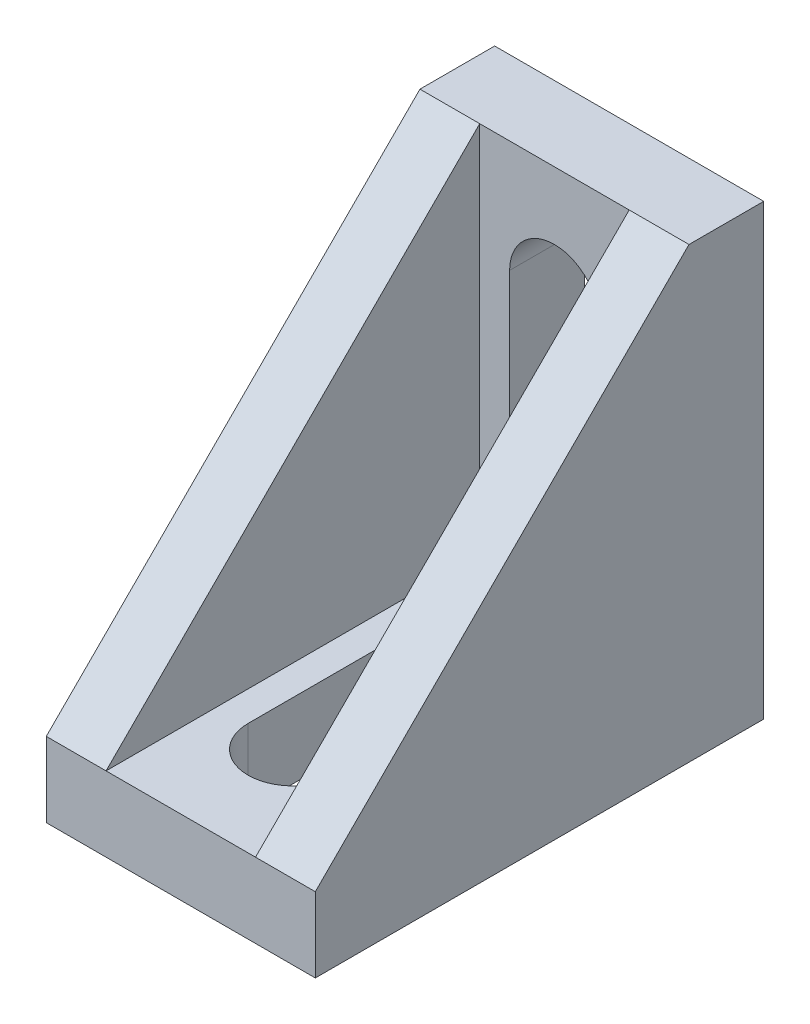
ISO-10303-21;
HEADER;
FILE_DESCRIPTION(('STEP AP214'),'2;1');
FILE_NAME('part.step','',(''),(''),'','','');
FILE_SCHEMA(('AUTOMOTIVE_DESIGN { 1 0 10303 214 1 1 1 1 }'));
ENDSEC;
DATA;
#1=APPLICATION_CONTEXT('core data for automotive mechanical design processes');
#2=APPLICATION_PROTOCOL_DEFINITION('international standard','automotive_design',2000,#1);
#3=PRODUCT_CONTEXT('',#1,'mechanical');
#4=PRODUCT('Part','Part','',(#3));
#5=PRODUCT_RELATED_PRODUCT_CATEGORY('part','',(#4));
#6=PRODUCT_DEFINITION_FORMATION('','',#4);
#7=PRODUCT_DEFINITION_CONTEXT('part definition',#1,'design');
#8=PRODUCT_DEFINITION('design','',#6,#7);
#9=PRODUCT_DEFINITION_SHAPE('','',#8);
#10=(LENGTH_UNIT() NAMED_UNIT(*) SI_UNIT(.MILLI.,.METRE.));
#11=(NAMED_UNIT(*) PLANE_ANGLE_UNIT() SI_UNIT($,.RADIAN.));
#12=(NAMED_UNIT(*) SI_UNIT($,.STERADIAN.) SOLID_ANGLE_UNIT());
#13=UNCERTAINTY_MEASURE_WITH_UNIT(LENGTH_MEASURE(1.E-05),#10,'distance_accuracy_value','');
#14=(GEOMETRIC_REPRESENTATION_CONTEXT(3) GLOBAL_UNCERTAINTY_ASSIGNED_CONTEXT((#13)) GLOBAL_UNIT_ASSIGNED_CONTEXT((#10,
#11,#12)) REPRESENTATION_CONTEXT('',''));
#15=CARTESIAN_POINT('',(0.,0.,0.));
#16=DIRECTION('',(0.,0.,1.));
#17=DIRECTION('',(1.,0.,0.));
#18=AXIS2_PLACEMENT_3D('',#15,#16,#17);
#19=CARTESIAN_POINT('',(0.,0.,5.));
#20=DIRECTION('',(0.,0.,1.));
#21=DIRECTION('',(1.,0.,0.));
#22=AXIS2_PLACEMENT_3D('',#19,#20,#21);
#23=PLANE('',#22);
#24=CARTESIAN_POINT('',(9.,12.5,5.));
#25=DIRECTION('',(0.,0.,1.));
#26=DIRECTION('',(1.,0.,0.));
#27=AXIS2_PLACEMENT_3D('',#24,#25,#26);
#28=CIRCLE('',#27,3.);
#29=CARTESIAN_POINT('',(6.,12.5,5.));
#30=VERTEX_POINT('',#29);
#31=CARTESIAN_POINT('',(12.,12.5,5.));
#32=VERTEX_POINT('',#31);
#33=EDGE_CURVE('E217',#30,#32,#28,.T.);
#34=ORIENTED_EDGE('',*,*,#33,.F.);
#35=DIRECTION('',(0.,-1.,0.));
#36=VECTOR('',#35,1.);
#37=CARTESIAN_POINT('',(6.,0.,5.));
#38=LINE('',#37,#36);
#39=CARTESIAN_POINT('',(5.99999999999999,22.5,5.));
#40=VERTEX_POINT('',#39);
#41=EDGE_CURVE('E220',#40,#30,#38,.T.);
#42=ORIENTED_EDGE('',*,*,#41,.F.);
#43=CARTESIAN_POINT('',(8.99999999999999,22.5,5.));
#44=DIRECTION('',(0.,0.,1.));
#45=DIRECTION('',(1.,0.,0.));
#46=AXIS2_PLACEMENT_3D('',#43,#44,#45);
#47=CIRCLE('',#46,3.);
#48=CARTESIAN_POINT('',(12.,22.5,5.));
#49=VERTEX_POINT('',#48);
#50=EDGE_CURVE('E224',#49,#40,#47,.T.);
#51=ORIENTED_EDGE('',*,*,#50,.F.);
#52=DIRECTION('',(0.,-1.,0.));
#53=VECTOR('',#52,1.);
#54=CARTESIAN_POINT('',(12.,0.,5.));
#55=LINE('',#54,#53);
#56=EDGE_CURVE('E227',#49,#32,#55,.T.);
#57=ORIENTED_EDGE('',*,*,#56,.T.);
#58=EDGE_LOOP('',(#34,#42,#51,#57));
#59=FACE_BOUND('',#58,.T.);
#60=DIRECTION('',(0.,-1.,0.));
#61=VECTOR('',#60,1.);
#62=CARTESIAN_POINT('',(4.,0.,5.));
#63=LINE('',#62,#61);
#64=CARTESIAN_POINT('',(4.,30.,5.));
#65=VERTEX_POINT('',#64);
#66=CARTESIAN_POINT('',(4.,8.,5.));
#67=VERTEX_POINT('',#66);
#68=EDGE_CURVE('E177',#65,#67,#63,.T.);
#69=ORIENTED_EDGE('',*,*,#68,.T.);
#70=DIRECTION('',(-1.,0.,0.));
#71=VECTOR('',#70,1.);
#72=CARTESIAN_POINT('',(0.,8.,5.));
#73=LINE('',#72,#71);
#74=CARTESIAN_POINT('',(14.,8.,5.));
#75=VERTEX_POINT('',#74);
#76=EDGE_CURVE('E42',#67,#75,#73,.F.);
#77=ORIENTED_EDGE('',*,*,#76,.T.);
#78=DIRECTION('',(0.,1.,0.));
#79=VECTOR('',#78,1.);
#80=CARTESIAN_POINT('',(14.,0.,5.));
#81=LINE('',#80,#79);
#82=CARTESIAN_POINT('',(14.,30.,5.));
#83=VERTEX_POINT('',#82);
#84=EDGE_CURVE('E358',#75,#83,#81,.T.);
#85=ORIENTED_EDGE('',*,*,#84,.T.);
#86=DIRECTION('',(1.,0.,0.));
#87=VECTOR('',#86,1.);
#88=CARTESIAN_POINT('',(0.,30.,5.));
#89=LINE('',#88,#87);
#90=EDGE_CURVE('E229',#65,#83,#89,.T.);
#91=ORIENTED_EDGE('',*,*,#90,.F.);
#92=EDGE_LOOP('',(#69,#77,#85,#91));
#93=FACE_BOUND('',#92,.T.);
#94=ADVANCED_FACE('F34',(#59,#93),#23,.T.);
#95=CARTESIAN_POINT('',(0.,5.,0.));
#96=DIRECTION('',(0.,-1.,0.));
#97=DIRECTION('',(0.,0.,-1.));
#98=AXIS2_PLACEMENT_3D('',#95,#96,#97);
#99=PLANE('',#98);
#100=CARTESIAN_POINT('',(9.,5.,22.5));
#101=DIRECTION('',(0.,-1.,0.));
#102=DIRECTION('',(0.,0.,-1.));
#103=AXIS2_PLACEMENT_3D('',#100,#101,#102);
#104=CIRCLE('',#103,3.);
#105=CARTESIAN_POINT('',(12.,5.,22.5));
#106=VERTEX_POINT('',#105);
#107=CARTESIAN_POINT('',(5.99999999999999,5.,22.5));
#108=VERTEX_POINT('',#107);
#109=EDGE_CURVE('E204',#106,#108,#104,.T.);
#110=ORIENTED_EDGE('',*,*,#109,.T.);
#111=DIRECTION('',(0.,0.,1.));
#112=VECTOR('',#111,1.);
#113=CARTESIAN_POINT('',(6.,5.,0.));
#114=LINE('',#113,#112);
#115=CARTESIAN_POINT('',(6.,5.,12.5));
#116=VERTEX_POINT('',#115);
#117=EDGE_CURVE('E165',#116,#108,#114,.T.);
#118=ORIENTED_EDGE('',*,*,#117,.F.);
#119=CARTESIAN_POINT('',(9.,5.,12.5));
#120=DIRECTION('',(0.,-1.,0.));
#121=DIRECTION('',(0.,0.,-1.));
#122=AXIS2_PLACEMENT_3D('',#119,#120,#121);
#123=CIRCLE('',#122,3.);
#124=CARTESIAN_POINT('',(12.,5.,12.5));
#125=VERTEX_POINT('',#124);
#126=EDGE_CURVE('E349',#116,#125,#123,.T.);
#127=ORIENTED_EDGE('',*,*,#126,.T.);
#128=DIRECTION('',(0.,0.,1.));
#129=VECTOR('',#128,1.);
#130=CARTESIAN_POINT('',(12.,5.,0.));
#131=LINE('',#130,#129);
#132=EDGE_CURVE('E344',#125,#106,#131,.T.);
#133=ORIENTED_EDGE('',*,*,#132,.T.);
#134=EDGE_LOOP('',(#110,#118,#127,#133));
#135=FACE_BOUND('',#134,.T.);
#136=DIRECTION('',(0.,0.,1.));
#137=VECTOR('',#136,1.);
#138=CARTESIAN_POINT('',(14.,5.,15.));
#139=LINE('',#138,#137);
#140=CARTESIAN_POINT('',(14.,5.,30.));
#141=VERTEX_POINT('',#140);
#142=CARTESIAN_POINT('',(14.,5.,8.));
#143=VERTEX_POINT('',#142);
#144=EDGE_CURVE('E364',#141,#143,#139,.F.);
#145=ORIENTED_EDGE('',*,*,#144,.T.);
#146=DIRECTION('',(-1.,0.,0.));
#147=VECTOR('',#146,1.);
#148=CARTESIAN_POINT('',(0.,5.,8.));
#149=LINE('',#148,#147);
#150=CARTESIAN_POINT('',(4.,5.,8.));
#151=VERTEX_POINT('',#150);
#152=EDGE_CURVE('E172',#143,#151,#149,.T.);
#153=ORIENTED_EDGE('',*,*,#152,.T.);
#154=DIRECTION('',(0.,0.,1.));
#155=VECTOR('',#154,1.);
#156=CARTESIAN_POINT('',(4.,5.,15.));
#157=LINE('',#156,#155);
#158=CARTESIAN_POINT('',(4.,5.,30.));
#159=VERTEX_POINT('',#158);
#160=EDGE_CURVE('E168',#159,#151,#157,.F.);
#161=ORIENTED_EDGE('',*,*,#160,.F.);
#162=DIRECTION('',(1.,0.,0.));
#163=VECTOR('',#162,1.);
#164=CARTESIAN_POINT('',(0.,5.,30.));
#165=LINE('',#164,#163);
#166=EDGE_CURVE('E152',#159,#141,#165,.T.);
#167=ORIENTED_EDGE('',*,*,#166,.T.);
#168=EDGE_LOOP('',(#145,#153,#161,#167));
#169=FACE_BOUND('',#168,.T.);
#170=ADVANCED_FACE('F170',(#135,#169),#99,.F.);
#171=CARTESIAN_POINT('',(0.,0.,5.));
#172=DIRECTION('',(0.,1.,0.));
#173=DIRECTION('',(-1.,0.,0.));
#174=AXIS2_PLACEMENT_3D('',#171,#172,#173);
#175=PLANE('',#174);
#176=DIRECTION('',(1.,0.,0.));
#177=VECTOR('',#176,1.);
#178=CARTESIAN_POINT('',(0.,0.,0.));
#179=LINE('',#178,#177);
#180=CARTESIAN_POINT('',(0.,0.,0.));
#181=VERTEX_POINT('',#180);
#182=CARTESIAN_POINT('',(18.,0.,0.));
#183=VERTEX_POINT('',#182);
#184=EDGE_CURVE('E245',#181,#183,#179,.T.);
#185=ORIENTED_EDGE('',*,*,#184,.T.);
#186=DIRECTION('',(0.,0.,-1.));
#187=VECTOR('',#186,1.);
#188=CARTESIAN_POINT('',(18.,0.,5.));
#189=LINE('',#188,#187);
#190=CARTESIAN_POINT('',(18.,0.,30.));
#191=VERTEX_POINT('',#190);
#192=EDGE_CURVE('E263',#191,#183,#189,.T.);
#193=ORIENTED_EDGE('',*,*,#192,.F.);
#194=DIRECTION('',(1.,0.,0.));
#195=VECTOR('',#194,1.);
#196=CARTESIAN_POINT('',(0.,0.,30.));
#197=LINE('',#196,#195);
#198=CARTESIAN_POINT('',(0.,0.,30.));
#199=VERTEX_POINT('',#198);
#200=EDGE_CURVE('E202',#199,#191,#197,.T.);
#201=ORIENTED_EDGE('',*,*,#200,.F.);
#202=DIRECTION('',(0.,0.,-1.));
#203=VECTOR('',#202,1.);
#204=CARTESIAN_POINT('',(0.,0.,5.));
#205=LINE('',#204,#203);
#206=EDGE_CURVE('E254',#199,#181,#205,.T.);
#207=ORIENTED_EDGE('',*,*,#206,.T.);
#208=EDGE_LOOP('',(#185,#193,#201,#207));
#209=FACE_BOUND('',#208,.T.);
#210=CARTESIAN_POINT('',(9.,0.,22.5));
#211=DIRECTION('',(0.,-1.,0.));
#212=DIRECTION('',(0.,0.,-1.));
#213=AXIS2_PLACEMENT_3D('',#210,#211,#212);
#214=CIRCLE('',#213,3.);
#215=CARTESIAN_POINT('',(12.,0.,22.5));
#216=VERTEX_POINT('',#215);
#217=CARTESIAN_POINT('',(5.99999999999999,0.,22.5));
#218=VERTEX_POINT('',#217);
#219=EDGE_CURVE('E191',#216,#218,#214,.T.);
#220=ORIENTED_EDGE('',*,*,#219,.F.);
#221=DIRECTION('',(0.,0.,1.));
#222=VECTOR('',#221,1.);
#223=CARTESIAN_POINT('',(12.,0.,0.));
#224=LINE('',#223,#222);
#225=CARTESIAN_POINT('',(12.,0.,12.5));
#226=VERTEX_POINT('',#225);
#227=EDGE_CURVE('E194',#226,#216,#224,.T.);
#228=ORIENTED_EDGE('',*,*,#227,.F.);
#229=CARTESIAN_POINT('',(9.,0.,12.5));
#230=DIRECTION('',(0.,-1.,0.));
#231=DIRECTION('',(0.,0.,-1.));
#232=AXIS2_PLACEMENT_3D('',#229,#230,#231);
#233=CIRCLE('',#232,3.);
#234=CARTESIAN_POINT('',(6.,0.,12.5));
#235=VERTEX_POINT('',#234);
#236=EDGE_CURVE('E197',#235,#226,#233,.T.);
#237=ORIENTED_EDGE('',*,*,#236,.F.);
#238=DIRECTION('',(0.,0.,1.));
#239=VECTOR('',#238,1.);
#240=CARTESIAN_POINT('',(6.,0.,0.));
#241=LINE('',#240,#239);
#242=EDGE_CURVE('E199',#235,#218,#241,.T.);
#243=ORIENTED_EDGE('',*,*,#242,.T.);
#244=EDGE_LOOP('',(#220,#228,#237,#243));
#245=FACE_BOUND('',#244,.T.);
#246=ADVANCED_FACE('F309',(#209,#245),#175,.F.);
#247=CARTESIAN_POINT('',(18.,0.,5.));
#248=DIRECTION('',(-1.,0.,0.));
#249=DIRECTION('',(0.,-1.,0.));
#250=AXIS2_PLACEMENT_3D('',#247,#248,#249);
#251=PLANE('',#250);
#252=DIRECTION('',(0.,1.,0.));
#253=VECTOR('',#252,1.);
#254=CARTESIAN_POINT('',(18.,0.,0.));
#255=LINE('',#254,#253);
#256=CARTESIAN_POINT('',(18.,30.,0.));
#257=VERTEX_POINT('',#256);
#258=EDGE_CURVE('E248',#183,#257,#255,.T.);
#259=ORIENTED_EDGE('',*,*,#258,.T.);
#260=DIRECTION('',(0.,0.,-1.));
#261=VECTOR('',#260,1.);
#262=CARTESIAN_POINT('',(18.,30.,5.));
#263=LINE('',#262,#261);
#264=CARTESIAN_POINT('',(18.,30.,5.));
#265=VERTEX_POINT('',#264);
#266=EDGE_CURVE('E260',#265,#257,#263,.T.);
#267=ORIENTED_EDGE('',*,*,#266,.F.);
#268=DIRECTION('',(0.,-0.707106781186547,0.707106781186547));
#269=VECTOR('',#268,1.);
#270=CARTESIAN_POINT('',(18.,30.,5.));
#271=LINE('',#270,#269);
#272=CARTESIAN_POINT('',(18.,5.,30.));
#273=VERTEX_POINT('',#272);
#274=EDGE_CURVE('E361',#265,#273,#271,.T.);
#275=ORIENTED_EDGE('',*,*,#274,.T.);
#276=DIRECTION('',(0.,-1.,0.));
#277=VECTOR('',#276,1.);
#278=CARTESIAN_POINT('',(18.,5.,30.));
#279=LINE('',#278,#277);
#280=EDGE_CURVE('E208',#273,#191,#279,.T.);
#281=ORIENTED_EDGE('',*,*,#280,.T.);
#282=ORIENTED_EDGE('',*,*,#192,.T.);
#283=EDGE_LOOP('',(#259,#267,#275,#281,#282));
#284=FACE_BOUND('',#283,.T.);
#285=ADVANCED_FACE('F322',(#284),#251,.F.);
#286=CARTESIAN_POINT('',(0.,30.,5.));
#287=DIRECTION('',(0.,1.,0.));
#288=DIRECTION('',(-1.,0.,0.));
#289=AXIS2_PLACEMENT_3D('',#286,#287,#288);
#290=PLANE('',#289);
#291=CARTESIAN_POINT('',(0.,30.,5.));
#292=VERTEX_POINT('',#291);
#293=EDGE_CURVE('E230',#292,#65,#89,.T.);
#294=ORIENTED_EDGE('',*,*,#293,.T.);
#295=ORIENTED_EDGE('',*,*,#90,.T.);
#296=DIRECTION('',(-1.,0.,0.));
#297=VECTOR('',#296,1.);
#298=CARTESIAN_POINT('',(0.,30.,5.));
#299=LINE('',#298,#297);
#300=EDGE_CURVE('E195',#265,#83,#299,.T.);
#301=ORIENTED_EDGE('',*,*,#300,.F.);
#302=ORIENTED_EDGE('',*,*,#266,.T.);
#303=DIRECTION('',(1.,0.,0.));
#304=VECTOR('',#303,1.);
#305=CARTESIAN_POINT('',(0.,30.,0.));
#306=LINE('',#305,#304);
#307=CARTESIAN_POINT('',(0.,30.,0.));
#308=VERTEX_POINT('',#307);
#309=EDGE_CURVE('E251',#308,#257,#306,.T.);
#310=ORIENTED_EDGE('',*,*,#309,.F.);
#311=DIRECTION('',(0.,0.,-1.));
#312=VECTOR('',#311,1.);
#313=CARTESIAN_POINT('',(0.,30.,5.));
#314=LINE('',#313,#312);
#315=EDGE_CURVE('E256',#292,#308,#314,.T.);
#316=ORIENTED_EDGE('',*,*,#315,.F.);
#317=EDGE_LOOP('',(#294,#295,#301,#302,#310,#316));
#318=FACE_BOUND('',#317,.T.);
#319=ADVANCED_FACE('F319',(#318),#290,.T.);
#320=CARTESIAN_POINT('',(9.,12.5,5.));
#321=DIRECTION('',(0.,0.,-1.));
#322=DIRECTION('',(-1.,0.,0.));
#323=AXIS2_PLACEMENT_3D('',#320,#321,#322);
#324=CYLINDRICAL_SURFACE('',#323,3.);
#325=CARTESIAN_POINT('',(9.,12.5,0.));
#326=DIRECTION('',(0.,0.,1.));
#327=DIRECTION('',(1.,0.,0.));
#328=AXIS2_PLACEMENT_3D('',#325,#326,#327);
#329=CIRCLE('',#328,3.);
#330=CARTESIAN_POINT('',(6.,12.5,0.));
#331=VERTEX_POINT('',#330);
#332=CARTESIAN_POINT('',(12.,12.5,0.));
#333=VERTEX_POINT('',#332);
#334=EDGE_CURVE('E207',#331,#333,#329,.T.);
#335=ORIENTED_EDGE('',*,*,#334,.F.);
#336=DIRECTION('',(0.,0.,-1.));
#337=VECTOR('',#336,1.);
#338=CARTESIAN_POINT('',(6.,12.5,5.));
#339=LINE('',#338,#337);
#340=EDGE_CURVE('E257',#30,#331,#339,.T.);
#341=ORIENTED_EDGE('',*,*,#340,.F.);
#342=ORIENTED_EDGE('',*,*,#33,.T.);
#343=DIRECTION('',(0.,0.,-1.));
#344=VECTOR('',#343,1.);
#345=CARTESIAN_POINT('',(12.,12.5,5.));
#346=LINE('',#345,#344);
#347=EDGE_CURVE('E233',#32,#333,#346,.T.);
#348=ORIENTED_EDGE('',*,*,#347,.T.);
#349=EDGE_LOOP('',(#335,#341,#342,#348));
#350=FACE_BOUND('',#349,.T.);
#351=ADVANCED_FACE('F280',(#350),#324,.F.);
#352=CARTESIAN_POINT('',(6.,0.,5.));
#353=DIRECTION('',(1.,0.,0.));
#354=DIRECTION('',(0.,1.,0.));
#355=AXIS2_PLACEMENT_3D('',#352,#353,#354);
#356=PLANE('',#355);
#357=DIRECTION('',(0.,-1.,0.));
#358=VECTOR('',#357,1.);
#359=CARTESIAN_POINT('',(6.,0.,0.));
#360=LINE('',#359,#358);
#361=CARTESIAN_POINT('',(5.99999999999999,22.5,0.));
#362=VERTEX_POINT('',#361);
#363=EDGE_CURVE('E236',#362,#331,#360,.T.);
#364=ORIENTED_EDGE('',*,*,#363,.F.);
#365=DIRECTION('',(0.,0.,-1.));
#366=VECTOR('',#365,1.);
#367=CARTESIAN_POINT('',(5.99999999999999,22.5,5.));
#368=LINE('',#367,#366);
#369=EDGE_CURVE('E269',#40,#362,#368,.T.);
#370=ORIENTED_EDGE('',*,*,#369,.F.);
#371=ORIENTED_EDGE('',*,*,#41,.T.);
#372=ORIENTED_EDGE('',*,*,#340,.T.);
#373=EDGE_LOOP('',(#364,#370,#371,#372));
#374=FACE_BOUND('',#373,.T.);
#375=ADVANCED_FACE('F276',(#374),#356,.T.);
#376=CARTESIAN_POINT('',(8.99999999999999,22.5,5.));
#377=DIRECTION('',(0.,0.,-1.));
#378=DIRECTION('',(-1.,0.,0.));
#379=AXIS2_PLACEMENT_3D('',#376,#377,#378);
#380=CYLINDRICAL_SURFACE('',#379,3.);
#381=CARTESIAN_POINT('',(8.99999999999999,22.5,0.));
#382=DIRECTION('',(0.,0.,1.));
#383=DIRECTION('',(1.,0.,0.));
#384=AXIS2_PLACEMENT_3D('',#381,#382,#383);
#385=CIRCLE('',#384,3.);
#386=CARTESIAN_POINT('',(12.,22.5,0.));
#387=VERTEX_POINT('',#386);
#388=EDGE_CURVE('E239',#387,#362,#385,.T.);
#389=ORIENTED_EDGE('',*,*,#388,.F.);
#390=DIRECTION('',(0.,0.,-1.));
#391=VECTOR('',#390,1.);
#392=CARTESIAN_POINT('',(12.,22.5,5.));
#393=LINE('',#392,#391);
#394=EDGE_CURVE('E267',#49,#387,#393,.T.);
#395=ORIENTED_EDGE('',*,*,#394,.F.);
#396=ORIENTED_EDGE('',*,*,#50,.T.);
#397=ORIENTED_EDGE('',*,*,#369,.T.);
#398=EDGE_LOOP('',(#389,#395,#396,#397));
#399=FACE_BOUND('',#398,.T.);
#400=ADVANCED_FACE('F287',(#399),#380,.F.);
#401=CARTESIAN_POINT('',(12.,0.,5.));
#402=DIRECTION('',(1.,0.,0.));
#403=DIRECTION('',(0.,1.,0.));
#404=AXIS2_PLACEMENT_3D('',#401,#402,#403);
#405=PLANE('',#404);
#406=DIRECTION('',(0.,-1.,0.));
#407=VECTOR('',#406,1.);
#408=CARTESIAN_POINT('',(12.,0.,0.));
#409=LINE('',#408,#407);
#410=EDGE_CURVE('E242',#387,#333,#409,.T.);
#411=ORIENTED_EDGE('',*,*,#410,.T.);
#412=ORIENTED_EDGE('',*,*,#347,.F.);
#413=ORIENTED_EDGE('',*,*,#56,.F.);
#414=ORIENTED_EDGE('',*,*,#394,.T.);
#415=EDGE_LOOP('',(#411,#412,#413,#414));
#416=FACE_BOUND('',#415,.T.);
#417=ADVANCED_FACE('F292',(#416),#405,.F.);
#418=CARTESIAN_POINT('',(0.,0.,5.));
#419=DIRECTION('',(-1.,0.,0.));
#420=DIRECTION('',(0.,0.,1.));
#421=AXIS2_PLACEMENT_3D('',#418,#419,#420);
#422=PLANE('',#421);
#423=DIRECTION('',(0.,-0.707106781186547,0.707106781186547));
#424=VECTOR('',#423,1.);
#425=CARTESIAN_POINT('',(0.,30.,5.));
#426=LINE('',#425,#424);
#427=CARTESIAN_POINT('',(0.,5.,30.));
#428=VERTEX_POINT('',#427);
#429=EDGE_CURVE('E180',#292,#428,#426,.T.);
#430=ORIENTED_EDGE('',*,*,#429,.F.);
#431=ORIENTED_EDGE('',*,*,#315,.T.);
#432=DIRECTION('',(0.,1.,0.));
#433=VECTOR('',#432,1.);
#434=CARTESIAN_POINT('',(0.,0.,0.));
#435=LINE('',#434,#433);
#436=EDGE_CURVE('E221',#181,#308,#435,.T.);
#437=ORIENTED_EDGE('',*,*,#436,.F.);
#438=ORIENTED_EDGE('',*,*,#206,.F.);
#439=DIRECTION('',(0.,-1.,0.));
#440=VECTOR('',#439,1.);
#441=CARTESIAN_POINT('',(0.,5.,30.));
#442=LINE('',#441,#440);
#443=EDGE_CURVE('E205',#428,#199,#442,.T.);
#444=ORIENTED_EDGE('',*,*,#443,.F.);
#445=EDGE_LOOP('',(#430,#431,#437,#438,#444));
#446=FACE_BOUND('',#445,.T.);
#447=ADVANCED_FACE('F294',(#446),#422,.T.);
#448=CARTESIAN_POINT('',(0.,0.,0.));
#449=DIRECTION('',(0.,0.,1.));
#450=DIRECTION('',(1.,0.,0.));
#451=AXIS2_PLACEMENT_3D('',#448,#449,#450);
#452=PLANE('',#451);
#453=ORIENTED_EDGE('',*,*,#436,.T.);
#454=ORIENTED_EDGE('',*,*,#309,.T.);
#455=ORIENTED_EDGE('',*,*,#258,.F.);
#456=ORIENTED_EDGE('',*,*,#184,.F.);
#457=EDGE_LOOP('',(#453,#454,#455,#456));
#458=FACE_BOUND('',#457,.T.);
#459=ORIENTED_EDGE('',*,*,#334,.T.);
#460=ORIENTED_EDGE('',*,*,#410,.F.);
#461=ORIENTED_EDGE('',*,*,#388,.T.);
#462=ORIENTED_EDGE('',*,*,#363,.T.);
#463=EDGE_LOOP('',(#459,#460,#461,#462));
#464=FACE_BOUND('',#463,.T.);
#465=ADVANCED_FACE('F284',(#458,#464),#452,.F.);
#466=CARTESIAN_POINT('',(0.,5.,30.));
#467=DIRECTION('',(0.,0.,-1.));
#468=DIRECTION('',(-1.,0.,0.));
#469=AXIS2_PLACEMENT_3D('',#466,#467,#468);
#470=PLANE('',#469);
#471=ORIENTED_EDGE('',*,*,#200,.T.);
#472=ORIENTED_EDGE('',*,*,#280,.F.);
#473=DIRECTION('',(1.,0.,0.));
#474=VECTOR('',#473,1.);
#475=CARTESIAN_POINT('',(18.,5.,30.));
#476=LINE('',#475,#474);
#477=EDGE_CURVE('E161',#141,#273,#476,.T.);
#478=ORIENTED_EDGE('',*,*,#477,.F.);
#479=ORIENTED_EDGE('',*,*,#166,.F.);
#480=EDGE_CURVE('E158',#428,#159,#165,.T.);
#481=ORIENTED_EDGE('',*,*,#480,.F.);
#482=ORIENTED_EDGE('',*,*,#443,.T.);
#483=EDGE_LOOP('',(#471,#472,#478,#479,#481,#482));
#484=FACE_BOUND('',#483,.T.);
#485=ADVANCED_FACE('F155',(#484),#470,.F.);
#486=CARTESIAN_POINT('',(9.,5.,22.5));
#487=DIRECTION('',(0.,-1.,0.));
#488=DIRECTION('',(0.,0.,-1.));
#489=AXIS2_PLACEMENT_3D('',#486,#487,#488);
#490=CYLINDRICAL_SURFACE('',#489,3.);
#491=ORIENTED_EDGE('',*,*,#219,.T.);
#492=DIRECTION('',(0.,-1.,0.));
#493=VECTOR('',#492,1.);
#494=CARTESIAN_POINT('',(5.99999999999999,5.,22.5));
#495=LINE('',#494,#493);
#496=EDGE_CURVE('E211',#108,#218,#495,.T.);
#497=ORIENTED_EDGE('',*,*,#496,.F.);
#498=ORIENTED_EDGE('',*,*,#109,.F.);
#499=DIRECTION('',(0.,-1.,0.));
#500=VECTOR('',#499,1.);
#501=CARTESIAN_POINT('',(12.,5.,22.5));
#502=LINE('',#501,#500);
#503=EDGE_CURVE('E184',#106,#216,#502,.T.);
#504=ORIENTED_EDGE('',*,*,#503,.T.);
#505=EDGE_LOOP('',(#491,#497,#498,#504));
#506=FACE_BOUND('',#505,.T.);
#507=ADVANCED_FACE('F314',(#506),#490,.F.);
#508=CARTESIAN_POINT('',(6.,5.,0.));
#509=DIRECTION('',(1.,0.,0.));
#510=DIRECTION('',(0.,0.,-1.));
#511=AXIS2_PLACEMENT_3D('',#508,#509,#510);
#512=PLANE('',#511);
#513=ORIENTED_EDGE('',*,*,#242,.F.);
#514=DIRECTION('',(0.,-1.,0.));
#515=VECTOR('',#514,1.);
#516=CARTESIAN_POINT('',(6.,5.,12.5));
#517=LINE('',#516,#515);
#518=EDGE_CURVE('E213',#116,#235,#517,.T.);
#519=ORIENTED_EDGE('',*,*,#518,.F.);
#520=ORIENTED_EDGE('',*,*,#117,.T.);
#521=ORIENTED_EDGE('',*,*,#496,.T.);
#522=EDGE_LOOP('',(#513,#519,#520,#521));
#523=FACE_BOUND('',#522,.T.);
#524=ADVANCED_FACE('F352',(#523),#512,.T.);
#525=CARTESIAN_POINT('',(9.,5.,12.5));
#526=DIRECTION('',(0.,-1.,0.));
#527=DIRECTION('',(0.,0.,-1.));
#528=AXIS2_PLACEMENT_3D('',#525,#526,#527);
#529=CYLINDRICAL_SURFACE('',#528,3.);
#530=ORIENTED_EDGE('',*,*,#236,.T.);
#531=DIRECTION('',(0.,-1.,0.));
#532=VECTOR('',#531,1.);
#533=CARTESIAN_POINT('',(12.,5.,12.5));
#534=LINE('',#533,#532);
#535=EDGE_CURVE('E186',#125,#226,#534,.T.);
#536=ORIENTED_EDGE('',*,*,#535,.F.);
#537=ORIENTED_EDGE('',*,*,#126,.F.);
#538=ORIENTED_EDGE('',*,*,#518,.T.);
#539=EDGE_LOOP('',(#530,#536,#537,#538));
#540=FACE_BOUND('',#539,.T.);
#541=ADVANCED_FACE('F348',(#540),#529,.F.);
#542=CARTESIAN_POINT('',(12.,5.,0.));
#543=DIRECTION('',(1.,0.,0.));
#544=DIRECTION('',(0.,0.,-1.));
#545=AXIS2_PLACEMENT_3D('',#542,#543,#544);
#546=PLANE('',#545);
#547=ORIENTED_EDGE('',*,*,#227,.T.);
#548=ORIENTED_EDGE('',*,*,#503,.F.);
#549=ORIENTED_EDGE('',*,*,#132,.F.);
#550=ORIENTED_EDGE('',*,*,#535,.T.);
#551=EDGE_LOOP('',(#547,#548,#549,#550));
#552=FACE_BOUND('',#551,.T.);
#553=ADVANCED_FACE('F343',(#552),#546,.F.);
#554=CARTESIAN_POINT('',(14.,15.,15.));
#555=DIRECTION('',(1.,0.,0.));
#556=DIRECTION('',(0.,1.,0.));
#557=AXIS2_PLACEMENT_3D('',#554,#555,#556);
#558=PLANE('',#557);
#559=ORIENTED_EDGE('',*,*,#84,.F.);
#560=CARTESIAN_POINT('',(14.,8.,8.));
#561=DIRECTION('',(1.,0.,0.));
#562=DIRECTION('',(0.,1.,0.));
#563=AXIS2_PLACEMENT_3D('',#560,#561,#562);
#564=CIRCLE('',#563,3.);
#565=EDGE_CURVE('E11',#75,#143,#564,.F.);
#566=ORIENTED_EDGE('',*,*,#565,.T.);
#567=ORIENTED_EDGE('',*,*,#144,.F.);
#568=DIRECTION('',(0.,-0.707106781186547,0.707106781186547));
#569=VECTOR('',#568,1.);
#570=CARTESIAN_POINT('',(14.,30.,5.));
#571=LINE('',#570,#569);
#572=EDGE_CURVE('E362',#83,#141,#571,.T.);
#573=ORIENTED_EDGE('',*,*,#572,.F.);
#574=EDGE_LOOP('',(#559,#566,#567,#573));
#575=FACE_BOUND('',#574,.T.);
#576=ADVANCED_FACE('F374',(#575),#558,.F.);
#577=CARTESIAN_POINT('',(18.,30.,5.));
#578=DIRECTION('',(0.,0.707106781186548,0.707106781186548));
#579=DIRECTION('',(0.,-0.707106781186547,0.707106781186547));
#580=AXIS2_PLACEMENT_3D('',#577,#578,#579);
#581=PLANE('',#580);
#582=ORIENTED_EDGE('',*,*,#274,.F.);
#583=ORIENTED_EDGE('',*,*,#300,.T.);
#584=ORIENTED_EDGE('',*,*,#572,.T.);
#585=ORIENTED_EDGE('',*,*,#477,.T.);
#586=EDGE_LOOP('',(#582,#583,#584,#585));
#587=FACE_BOUND('',#586,.T.);
#588=ADVANCED_FACE('F379',(#587),#581,.T.);
#589=CARTESIAN_POINT('',(4.,15.,15.));
#590=DIRECTION('',(-1.,0.,0.));
#591=DIRECTION('',(0.,0.,1.));
#592=AXIS2_PLACEMENT_3D('',#589,#590,#591);
#593=PLANE('',#592);
#594=ORIENTED_EDGE('',*,*,#160,.T.);
#595=CARTESIAN_POINT('',(4.,8.,8.));
#596=DIRECTION('',(-1.,0.,0.));
#597=DIRECTION('',(0.,0.,1.));
#598=AXIS2_PLACEMENT_3D('',#595,#596,#597);
#599=CIRCLE('',#598,3.);
#600=EDGE_CURVE('E56',#151,#67,#599,.F.);
#601=ORIENTED_EDGE('',*,*,#600,.T.);
#602=ORIENTED_EDGE('',*,*,#68,.F.);
#603=DIRECTION('',(0.,-0.707106781186547,0.707106781186547));
#604=VECTOR('',#603,1.);
#605=CARTESIAN_POINT('',(4.,30.,5.));
#606=LINE('',#605,#604);
#607=EDGE_CURVE('E173',#65,#159,#606,.T.);
#608=ORIENTED_EDGE('',*,*,#607,.T.);
#609=EDGE_LOOP('',(#594,#601,#602,#608));
#610=FACE_BOUND('',#609,.T.);
#611=ADVANCED_FACE('F176',(#610),#593,.F.);
#612=CARTESIAN_POINT('',(0.,30.,5.));
#613=DIRECTION('',(0.,-0.707106781186548,-0.707106781186548));
#614=DIRECTION('',(0.,-0.707106781186547,0.707106781186547));
#615=AXIS2_PLACEMENT_3D('',#612,#613,#614);
#616=PLANE('',#615);
#617=ORIENTED_EDGE('',*,*,#293,.F.);
#618=ORIENTED_EDGE('',*,*,#429,.T.);
#619=ORIENTED_EDGE('',*,*,#480,.T.);
#620=ORIENTED_EDGE('',*,*,#607,.F.);
#621=EDGE_LOOP('',(#617,#618,#619,#620));
#622=FACE_BOUND('',#621,.T.);
#623=ADVANCED_FACE('F182',(#622),#616,.F.);
#624=CARTESIAN_POINT('',(0.,8.,8.));
#625=DIRECTION('',(-1.,0.,0.));
#626=DIRECTION('',(0.,0.,1.));
#627=AXIS2_PLACEMENT_3D('',#624,#625,#626);
#628=CYLINDRICAL_SURFACE('',#627,3.);
#629=ORIENTED_EDGE('',*,*,#565,.F.);
#630=ORIENTED_EDGE('',*,*,#76,.F.);
#631=ORIENTED_EDGE('',*,*,#600,.F.);
#632=ORIENTED_EDGE('',*,*,#152,.F.);
#633=EDGE_LOOP('',(#629,#630,#631,#632));
#634=FACE_BOUND('',#633,.T.);
#635=ADVANCED_FACE('F36',(#634),#628,.F.);
#636=CLOSED_SHELL('',(#94,#170,#246,#285,#319,#351,#375,#400,#417,#447,#465,#485,#507,#524,#541,
#553,#576,#588,#611,#623,#635));
#637=MANIFOLD_SOLID_BREP('B2',#636);
#638=ADVANCED_BREP_SHAPE_REPRESENTATION('',(#18,#637),#14);
#639=SHAPE_DEFINITION_REPRESENTATION(#9,#638);
ENDSEC;
END-ISO-10303-21;
